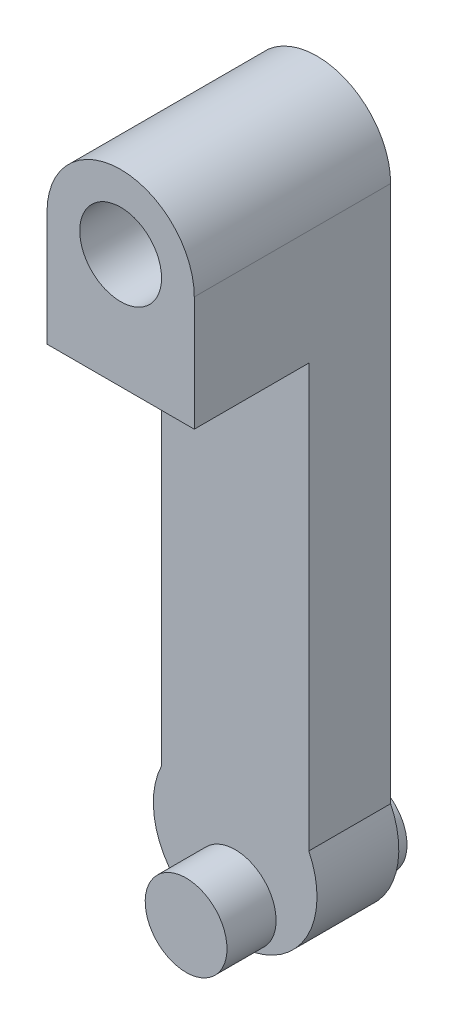
ISO-10303-21;
HEADER;
FILE_DESCRIPTION(('STEP AP214'),'2;1');
FILE_NAME('part.step','',(''),(''),'','','');
FILE_SCHEMA(('AUTOMOTIVE_DESIGN { 1 0 10303 214 1 1 1 1 }'));
ENDSEC;
DATA;
#1=APPLICATION_CONTEXT('core data for automotive mechanical design processes');
#2=APPLICATION_PROTOCOL_DEFINITION('international standard','automotive_design',2000,#1);
#3=PRODUCT_CONTEXT('',#1,'mechanical');
#4=PRODUCT('Part','Part','',(#3));
#5=PRODUCT_RELATED_PRODUCT_CATEGORY('part','',(#4));
#6=PRODUCT_DEFINITION_FORMATION('','',#4);
#7=PRODUCT_DEFINITION_CONTEXT('part definition',#1,'design');
#8=PRODUCT_DEFINITION('design','',#6,#7);
#9=PRODUCT_DEFINITION_SHAPE('','',#8);
#10=(LENGTH_UNIT() NAMED_UNIT(*) SI_UNIT(.MILLI.,.METRE.));
#11=(NAMED_UNIT(*) PLANE_ANGLE_UNIT() SI_UNIT($,.RADIAN.));
#12=(NAMED_UNIT(*) SI_UNIT($,.STERADIAN.) SOLID_ANGLE_UNIT());
#13=UNCERTAINTY_MEASURE_WITH_UNIT(LENGTH_MEASURE(1.E-05),#10,'distance_accuracy_value','');
#14=(GEOMETRIC_REPRESENTATION_CONTEXT(3) GLOBAL_UNCERTAINTY_ASSIGNED_CONTEXT((#13)) GLOBAL_UNIT_ASSIGNED_CONTEXT((#10,
#11,#12)) REPRESENTATION_CONTEXT('',''));
#15=CARTESIAN_POINT('',(0.,0.,0.));
#16=DIRECTION('',(0.,0.,1.));
#17=DIRECTION('',(1.,0.,0.));
#18=AXIS2_PLACEMENT_3D('',#15,#16,#17);
#19=CARTESIAN_POINT('',(0.,0.,6.35));
#20=DIRECTION('',(0.,0.,1.));
#21=DIRECTION('',(1.,0.,0.));
#22=AXIS2_PLACEMENT_3D('',#19,#20,#21);
#23=PLANE('',#22);
#24=DIRECTION('',(0.,1.,0.));
#25=VECTOR('',#24,1.);
#26=CARTESIAN_POINT('',(5.715,0.,6.35));
#27=LINE('',#26,#25);
#28=CARTESIAN_POINT('',(5.715,-41.6820991708517,6.35));
#29=VERTEX_POINT('',#28);
#30=CARTESIAN_POINT('',(5.715,-8.89,6.35));
#31=VERTEX_POINT('',#30);
#32=EDGE_CURVE('E60',#29,#31,#27,.T.);
#33=ORIENTED_EDGE('',*,*,#32,.T.);
#34=DIRECTION('',(1.,0.,0.));
#35=VECTOR('',#34,1.);
#36=CARTESIAN_POINT('',(-5.715,-8.89,6.35));
#37=LINE('',#36,#35);
#38=CARTESIAN_POINT('',(-5.715,-8.89,6.35));
#39=VERTEX_POINT('',#38);
#40=EDGE_CURVE('E55',#39,#31,#37,.T.);
#41=ORIENTED_EDGE('',*,*,#40,.F.);
#42=DIRECTION('',(0.,-1.,0.));
#43=VECTOR('',#42,1.);
#44=CARTESIAN_POINT('',(-5.715,0.,6.35));
#45=LINE('',#44,#43);
#46=CARTESIAN_POINT('',(-5.715,-41.6820991708517,6.35));
#47=VERTEX_POINT('',#46);
#48=EDGE_CURVE('E122',#39,#47,#45,.T.);
#49=ORIENTED_EDGE('',*,*,#48,.T.);
#50=CARTESIAN_POINT('',(0.,-44.45,6.35));
#51=DIRECTION('',(0.,0.,1.));
#52=DIRECTION('',(1.,0.,0.));
#53=AXIS2_PLACEMENT_3D('',#50,#51,#52);
#54=CIRCLE('',#53,6.35);
#55=CARTESIAN_POINT('',(0.,-50.8,6.35));
#56=VERTEX_POINT('',#55);
#57=EDGE_CURVE('E154',#47,#56,#54,.T.);
#58=ORIENTED_EDGE('',*,*,#57,.T.);
#59=CARTESIAN_POINT('',(0.,-47.625,6.35));
#60=DIRECTION('',(0.,0.,1.));
#61=DIRECTION('',(1.,0.,0.));
#62=AXIS2_PLACEMENT_3D('',#59,#60,#61);
#63=CIRCLE('',#62,3.17499999999999);
#64=EDGE_CURVE('E136',#56,#56,#63,.T.);
#65=ORIENTED_EDGE('',*,*,#64,.F.);
#66=EDGE_CURVE('E152',#56,#29,#54,.T.);
#67=ORIENTED_EDGE('',*,*,#66,.T.);
#68=EDGE_LOOP('',(#33,#41,#49,#58,#65,#67));
#69=FACE_BOUND('',#68,.T.);
#70=ADVANCED_FACE('F39',(#69),#23,.T.);
#71=CARTESIAN_POINT('',(0.,0.,0.));
#72=DIRECTION('',(0.,0.,1.));
#73=DIRECTION('',(1.,0.,0.));
#74=AXIS2_PLACEMENT_3D('',#71,#72,#73);
#75=PLANE('',#74);
#76=CARTESIAN_POINT('',(0.,-44.45,0.));
#77=DIRECTION('',(0.,0.,1.));
#78=DIRECTION('',(1.,0.,0.));
#79=AXIS2_PLACEMENT_3D('',#76,#77,#78);
#80=CIRCLE('',#79,6.35);
#81=CARTESIAN_POINT('',(0.,-50.8,0.));
#82=VERTEX_POINT('',#81);
#83=CARTESIAN_POINT('',(5.715,-41.6820991708517,0.));
#84=VERTEX_POINT('',#83);
#85=EDGE_CURVE('E166',#82,#84,#80,.T.);
#86=ORIENTED_EDGE('',*,*,#85,.F.);
#87=CARTESIAN_POINT('',(0.,-47.625,0.));
#88=DIRECTION('',(0.,0.,1.));
#89=DIRECTION('',(1.,0.,0.));
#90=AXIS2_PLACEMENT_3D('',#87,#88,#89);
#91=CIRCLE('',#90,3.17499999999999);
#92=EDGE_CURVE('E124',#82,#82,#91,.T.);
#93=ORIENTED_EDGE('',*,*,#92,.T.);
#94=CARTESIAN_POINT('',(-5.715,-41.6820991708517,0.));
#95=VERTEX_POINT('',#94);
#96=EDGE_CURVE('E167',#95,#82,#80,.T.);
#97=ORIENTED_EDGE('',*,*,#96,.F.);
#98=DIRECTION('',(0.,-1.,0.));
#99=VECTOR('',#98,1.);
#100=CARTESIAN_POINT('',(-5.715,0.,0.));
#101=LINE('',#100,#99);
#102=CARTESIAN_POINT('',(-5.715,0.,0.));
#103=VERTEX_POINT('',#102);
#104=EDGE_CURVE('E163',#103,#95,#101,.T.);
#105=ORIENTED_EDGE('',*,*,#104,.F.);
#106=CARTESIAN_POINT('',(0.,0.,0.));
#107=DIRECTION('',(0.,0.,1.));
#108=DIRECTION('',(1.,0.,0.));
#109=AXIS2_PLACEMENT_3D('',#106,#107,#108);
#110=CIRCLE('',#109,5.715);
#111=CARTESIAN_POINT('',(5.715,0.,0.));
#112=VERTEX_POINT('',#111);
#113=EDGE_CURVE('E149',#112,#103,#110,.T.);
#114=ORIENTED_EDGE('',*,*,#113,.F.);
#115=DIRECTION('',(0.,1.,0.));
#116=VECTOR('',#115,1.);
#117=CARTESIAN_POINT('',(5.715,0.,0.));
#118=LINE('',#117,#116);
#119=EDGE_CURVE('E153',#84,#112,#118,.T.);
#120=ORIENTED_EDGE('',*,*,#119,.F.);
#121=EDGE_LOOP('',(#86,#93,#97,#105,#114,#120));
#122=FACE_BOUND('',#121,.T.);
#123=CARTESIAN_POINT('',(0.,0.,0.));
#124=DIRECTION('',(0.,0.,1.));
#125=DIRECTION('',(1.,0.,0.));
#126=AXIS2_PLACEMENT_3D('',#123,#124,#125);
#127=CIRCLE('',#126,3.175);
#128=CARTESIAN_POINT('',(3.175,0.,0.));
#129=VERTEX_POINT('',#128);
#130=EDGE_CURVE('E142',#129,#129,#127,.T.);
#131=ORIENTED_EDGE('',*,*,#130,.T.);
#132=EDGE_LOOP('',(#131));
#133=FACE_BOUND('',#132,.T.);
#134=ADVANCED_FACE('F188',(#122,#133),#75,.F.);
#135=CARTESIAN_POINT('',(0.,0.,6.35));
#136=DIRECTION('',(0.,0.,-1.));
#137=DIRECTION('',(-1.,0.,0.));
#138=AXIS2_PLACEMENT_3D('',#135,#136,#137);
#139=CYLINDRICAL_SURFACE('',#138,5.715);
#140=ORIENTED_EDGE('',*,*,#113,.T.);
#141=DIRECTION('',(0.,0.,-1.));
#142=VECTOR('',#141,1.);
#143=CARTESIAN_POINT('',(-5.715,0.,6.35));
#144=LINE('',#143,#142);
#145=CARTESIAN_POINT('',(-5.715,0.,15.24));
#146=VERTEX_POINT('',#145);
#147=EDGE_CURVE('E11',#146,#103,#144,.T.);
#148=ORIENTED_EDGE('',*,*,#147,.F.);
#149=CARTESIAN_POINT('',(0.,0.,15.24));
#150=DIRECTION('',(0.,0.,1.));
#151=DIRECTION('',(1.,0.,0.));
#152=AXIS2_PLACEMENT_3D('',#149,#150,#151);
#153=CIRCLE('',#152,5.715);
#154=CARTESIAN_POINT('',(5.715,0.,15.24));
#155=VERTEX_POINT('',#154);
#156=EDGE_CURVE('E116',#155,#146,#153,.T.);
#157=ORIENTED_EDGE('',*,*,#156,.F.);
#158=DIRECTION('',(0.,0.,-1.));
#159=VECTOR('',#158,1.);
#160=CARTESIAN_POINT('',(5.715,0.,6.35));
#161=LINE('',#160,#159);
#162=EDGE_CURVE('E159',#155,#112,#161,.T.);
#163=ORIENTED_EDGE('',*,*,#162,.T.);
#164=EDGE_LOOP('',(#140,#148,#157,#163));
#165=FACE_BOUND('',#164,.T.);
#166=ADVANCED_FACE('F41',(#165),#139,.T.);
#167=CARTESIAN_POINT('',(-5.715,0.,6.35));
#168=DIRECTION('',(1.,0.,0.));
#169=DIRECTION('',(0.,0.,-1.));
#170=AXIS2_PLACEMENT_3D('',#167,#168,#169);
#171=PLANE('',#170);
#172=ORIENTED_EDGE('',*,*,#104,.T.);
#173=DIRECTION('',(0.,0.,-1.));
#174=VECTOR('',#173,1.);
#175=CARTESIAN_POINT('',(-5.715,-41.6820991708517,6.35));
#176=LINE('',#175,#174);
#177=EDGE_CURVE('E48',#47,#95,#176,.T.);
#178=ORIENTED_EDGE('',*,*,#177,.F.);
#179=ORIENTED_EDGE('',*,*,#48,.F.);
#180=DIRECTION('',(0.,0.,-1.));
#181=VECTOR('',#180,1.);
#182=CARTESIAN_POINT('',(-5.715,-8.89,15.24));
#183=LINE('',#182,#181);
#184=CARTESIAN_POINT('',(-5.715,-8.89,15.24));
#185=VERTEX_POINT('',#184);
#186=EDGE_CURVE('E101',#185,#39,#183,.T.);
#187=ORIENTED_EDGE('',*,*,#186,.F.);
#188=DIRECTION('',(0.,-1.,0.));
#189=VECTOR('',#188,1.);
#190=CARTESIAN_POINT('',(-5.715,0.,15.24));
#191=LINE('',#190,#189);
#192=EDGE_CURVE('E109',#146,#185,#191,.T.);
#193=ORIENTED_EDGE('',*,*,#192,.F.);
#194=ORIENTED_EDGE('',*,*,#147,.T.);
#195=EDGE_LOOP('',(#172,#178,#179,#187,#193,#194));
#196=FACE_BOUND('',#195,.T.);
#197=ADVANCED_FACE('F120',(#196),#171,.F.);
#198=CARTESIAN_POINT('',(0.,-44.45,6.35));
#199=DIRECTION('',(0.,0.,-1.));
#200=DIRECTION('',(-1.,0.,0.));
#201=AXIS2_PLACEMENT_3D('',#198,#199,#200);
#202=CYLINDRICAL_SURFACE('',#201,6.35);
#203=ORIENTED_EDGE('',*,*,#96,.T.);
#204=ORIENTED_EDGE('',*,*,#85,.T.);
#205=DIRECTION('',(0.,0.,-1.));
#206=VECTOR('',#205,1.);
#207=CARTESIAN_POINT('',(5.715,-41.6820991708517,6.35));
#208=LINE('',#207,#206);
#209=EDGE_CURVE('E176',#29,#84,#208,.T.);
#210=ORIENTED_EDGE('',*,*,#209,.F.);
#211=ORIENTED_EDGE('',*,*,#66,.F.);
#212=ORIENTED_EDGE('',*,*,#57,.F.);
#213=ORIENTED_EDGE('',*,*,#177,.T.);
#214=EDGE_LOOP('',(#203,#204,#210,#211,#212,#213));
#215=FACE_BOUND('',#214,.T.);
#216=ADVANCED_FACE('F184',(#215),#202,.T.);
#217=CARTESIAN_POINT('',(5.715,0.,6.35));
#218=DIRECTION('',(-1.,0.,0.));
#219=DIRECTION('',(0.,0.,1.));
#220=AXIS2_PLACEMENT_3D('',#217,#218,#219);
#221=PLANE('',#220);
#222=ORIENTED_EDGE('',*,*,#119,.T.);
#223=ORIENTED_EDGE('',*,*,#162,.F.);
#224=DIRECTION('',(0.,1.,0.));
#225=VECTOR('',#224,1.);
#226=CARTESIAN_POINT('',(5.715,-8.89,15.24));
#227=LINE('',#226,#225);
#228=CARTESIAN_POINT('',(5.715,-8.89,15.24));
#229=VERTEX_POINT('',#228);
#230=EDGE_CURVE('E108',#229,#155,#227,.T.);
#231=ORIENTED_EDGE('',*,*,#230,.F.);
#232=DIRECTION('',(0.,0.,-1.));
#233=VECTOR('',#232,1.);
#234=CARTESIAN_POINT('',(5.715,-8.89,15.24));
#235=LINE('',#234,#233);
#236=EDGE_CURVE('E103',#229,#31,#235,.T.);
#237=ORIENTED_EDGE('',*,*,#236,.T.);
#238=ORIENTED_EDGE('',*,*,#32,.F.);
#239=ORIENTED_EDGE('',*,*,#209,.T.);
#240=EDGE_LOOP('',(#222,#223,#231,#237,#238,#239));
#241=FACE_BOUND('',#240,.T.);
#242=ADVANCED_FACE('F218',(#241),#221,.F.);
#243=CARTESIAN_POINT('',(0.,0.,6.35));
#244=DIRECTION('',(0.,0.,-1.));
#245=DIRECTION('',(-1.,0.,0.));
#246=AXIS2_PLACEMENT_3D('',#243,#244,#245);
#247=CYLINDRICAL_SURFACE('',#246,3.175);
#248=ORIENTED_EDGE('',*,*,#130,.F.);
#249=EDGE_LOOP('',(#248));
#250=FACE_BOUND('',#249,.T.);
#251=CARTESIAN_POINT('',(0.,0.,15.24));
#252=DIRECTION('',(0.,0.,1.));
#253=DIRECTION('',(1.,0.,0.));
#254=AXIS2_PLACEMENT_3D('',#251,#252,#253);
#255=CIRCLE('',#254,3.175);
#256=CARTESIAN_POINT('',(3.175,0.,15.24));
#257=VERTEX_POINT('',#256);
#258=EDGE_CURVE('E248',#257,#257,#255,.T.);
#259=ORIENTED_EDGE('',*,*,#258,.T.);
#260=EDGE_LOOP('',(#259));
#261=FACE_BOUND('',#260,.T.);
#262=ADVANCED_FACE('F215',(#250,#261),#247,.F.);
#263=CARTESIAN_POINT('',(0.,-47.625,10.16));
#264=DIRECTION('',(0.,0.,-1.));
#265=DIRECTION('',(-1.,0.,0.));
#266=AXIS2_PLACEMENT_3D('',#263,#264,#265);
#267=CYLINDRICAL_SURFACE('',#266,3.17499999999999);
#268=CARTESIAN_POINT('',(0.,-47.625,10.16));
#269=DIRECTION('',(0.,0.,1.));
#270=DIRECTION('',(1.,0.,0.));
#271=AXIS2_PLACEMENT_3D('',#268,#269,#270);
#272=CIRCLE('',#271,3.17499999999999);
#273=CARTESIAN_POINT('',(3.17499999999999,-47.625,10.16));
#274=VERTEX_POINT('',#273);
#275=EDGE_CURVE('E138',#274,#274,#272,.T.);
#276=ORIENTED_EDGE('',*,*,#275,.F.);
#277=EDGE_LOOP('',(#276));
#278=FACE_BOUND('',#277,.T.);
#279=ORIENTED_EDGE('',*,*,#64,.T.);
#280=EDGE_LOOP('',(#279));
#281=FACE_BOUND('',#280,.T.);
#282=ADVANCED_FACE('F205',(#278,#281),#267,.T.);
#283=CARTESIAN_POINT('',(0.,-47.625,10.16));
#284=DIRECTION('',(0.,0.,1.));
#285=DIRECTION('',(1.,0.,0.));
#286=AXIS2_PLACEMENT_3D('',#283,#284,#285);
#287=PLANE('',#286);
#288=ORIENTED_EDGE('',*,*,#275,.T.);
#289=EDGE_LOOP('',(#288));
#290=FACE_BOUND('',#289,.T.);
#291=ADVANCED_FACE('F196',(#290),#287,.T.);
#292=CARTESIAN_POINT('',(0.,-47.625,-3.81));
#293=DIRECTION('',(0.,0.,1.));
#294=DIRECTION('',(1.,0.,0.));
#295=AXIS2_PLACEMENT_3D('',#292,#293,#294);
#296=CYLINDRICAL_SURFACE('',#295,3.17499999999999);
#297=CARTESIAN_POINT('',(0.,-47.625,-3.81));
#298=DIRECTION('',(0.,0.,1.));
#299=DIRECTION('',(1.,0.,0.));
#300=AXIS2_PLACEMENT_3D('',#297,#298,#299);
#301=CIRCLE('',#300,3.17499999999999);
#302=CARTESIAN_POINT('',(3.17499999999999,-47.625,-3.81));
#303=VERTEX_POINT('',#302);
#304=EDGE_CURVE('E129',#303,#303,#301,.T.);
#305=ORIENTED_EDGE('',*,*,#304,.T.);
#306=EDGE_LOOP('',(#305));
#307=FACE_BOUND('',#306,.T.);
#308=ORIENTED_EDGE('',*,*,#92,.F.);
#309=EDGE_LOOP('',(#308));
#310=FACE_BOUND('',#309,.T.);
#311=ADVANCED_FACE('F193',(#307,#310),#296,.T.);
#312=CARTESIAN_POINT('',(0.,-47.625,-3.81));
#313=DIRECTION('',(0.,0.,1.));
#314=DIRECTION('',(1.,0.,0.));
#315=AXIS2_PLACEMENT_3D('',#312,#313,#314);
#316=PLANE('',#315);
#317=ORIENTED_EDGE('',*,*,#304,.F.);
#318=EDGE_LOOP('',(#317));
#319=FACE_BOUND('',#318,.T.);
#320=ADVANCED_FACE('F195',(#319),#316,.F.);
#321=CARTESIAN_POINT('',(0.,0.,15.24));
#322=DIRECTION('',(0.,0.,1.));
#323=DIRECTION('',(1.,0.,0.));
#324=AXIS2_PLACEMENT_3D('',#321,#322,#323);
#325=PLANE('',#324);
#326=ORIENTED_EDGE('',*,*,#192,.T.);
#327=DIRECTION('',(1.,0.,0.));
#328=VECTOR('',#327,1.);
#329=CARTESIAN_POINT('',(-5.715,-8.89,15.24));
#330=LINE('',#329,#328);
#331=EDGE_CURVE('E97',#185,#229,#330,.T.);
#332=ORIENTED_EDGE('',*,*,#331,.T.);
#333=ORIENTED_EDGE('',*,*,#230,.T.);
#334=ORIENTED_EDGE('',*,*,#156,.T.);
#335=EDGE_LOOP('',(#326,#332,#333,#334));
#336=FACE_BOUND('',#335,.T.);
#337=ORIENTED_EDGE('',*,*,#258,.F.);
#338=EDGE_LOOP('',(#337));
#339=FACE_BOUND('',#338,.T.);
#340=ADVANCED_FACE('F113',(#336,#339),#325,.T.);
#341=CARTESIAN_POINT('',(-5.715,-8.89,15.24));
#342=DIRECTION('',(0.,1.,0.));
#343=DIRECTION('',(0.,0.,1.));
#344=AXIS2_PLACEMENT_3D('',#341,#342,#343);
#345=PLANE('',#344);
#346=ORIENTED_EDGE('',*,*,#40,.T.);
#347=ORIENTED_EDGE('',*,*,#236,.F.);
#348=ORIENTED_EDGE('',*,*,#331,.F.);
#349=ORIENTED_EDGE('',*,*,#186,.T.);
#350=EDGE_LOOP('',(#346,#347,#348,#349));
#351=FACE_BOUND('',#350,.T.);
#352=ADVANCED_FACE('F99',(#351),#345,.F.);
#353=CLOSED_SHELL('',(#70,#134,#166,#197,#216,#242,#262,#282,#291,#311,#320,#340,#352));
#354=MANIFOLD_SOLID_BREP('B2',#353);
#355=ADVANCED_BREP_SHAPE_REPRESENTATION('',(#18,#354),#14);
#356=SHAPE_DEFINITION_REPRESENTATION(#9,#355);
ENDSEC;
END-ISO-10303-21;
